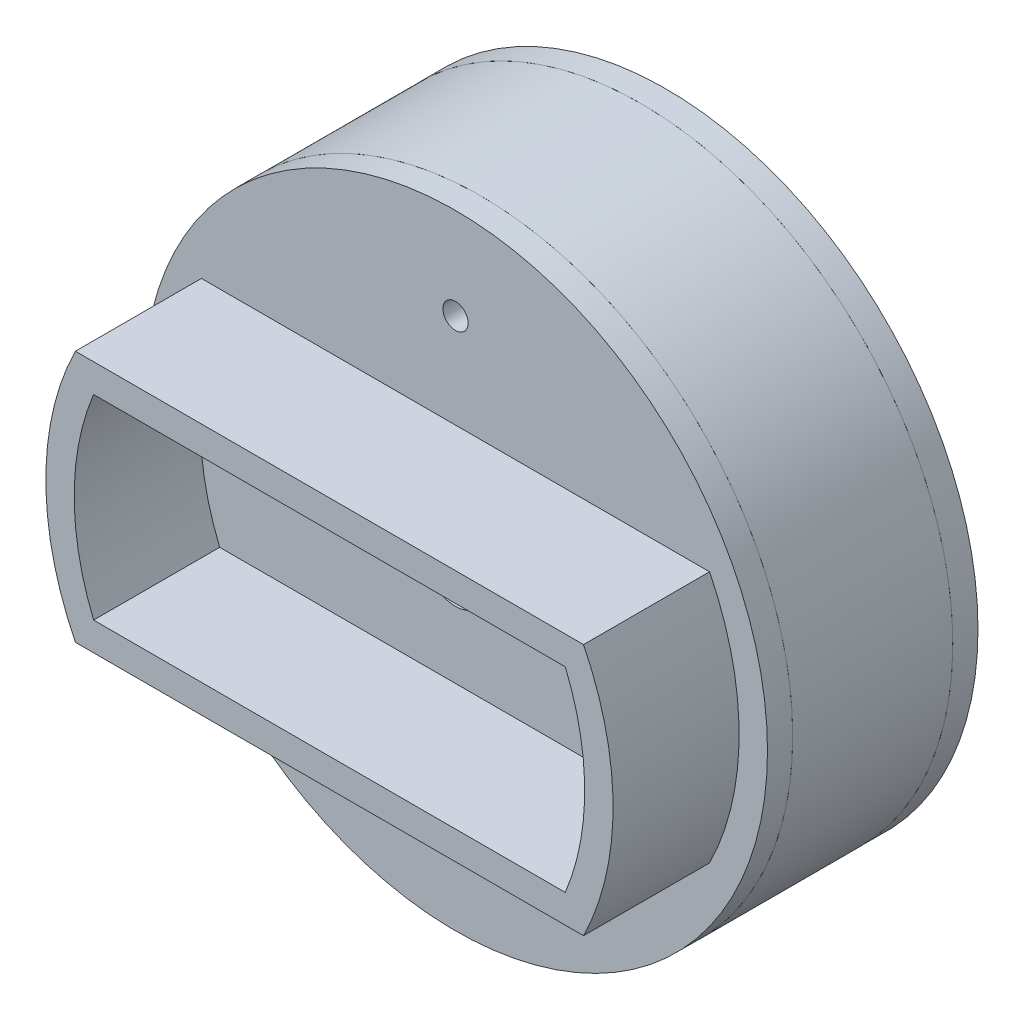
ISO-10303-21;
HEADER;
FILE_DESCRIPTION(('STEP AP214'),'2;1');
FILE_NAME('part.step','',(''),(''),'','','');
FILE_SCHEMA(('AUTOMOTIVE_DESIGN { 1 0 10303 214 1 1 1 1 }'));
ENDSEC;
DATA;
#1=APPLICATION_CONTEXT('core data for automotive mechanical design processes');
#2=APPLICATION_PROTOCOL_DEFINITION('international standard','automotive_design',2000,#1);
#3=PRODUCT_CONTEXT('',#1,'mechanical');
#4=PRODUCT('Part','Part','',(#3));
#5=PRODUCT_RELATED_PRODUCT_CATEGORY('part','',(#4));
#6=PRODUCT_DEFINITION_FORMATION('','',#4);
#7=PRODUCT_DEFINITION_CONTEXT('part definition',#1,'design');
#8=PRODUCT_DEFINITION('design','',#6,#7);
#9=PRODUCT_DEFINITION_SHAPE('','',#8);
#10=(LENGTH_UNIT() NAMED_UNIT(*) SI_UNIT(.MILLI.,.METRE.));
#11=(NAMED_UNIT(*) PLANE_ANGLE_UNIT() SI_UNIT($,.RADIAN.));
#12=(NAMED_UNIT(*) SI_UNIT($,.STERADIAN.) SOLID_ANGLE_UNIT());
#13=UNCERTAINTY_MEASURE_WITH_UNIT(LENGTH_MEASURE(1.E-05),#10,'distance_accuracy_value','');
#14=(GEOMETRIC_REPRESENTATION_CONTEXT(3) GLOBAL_UNCERTAINTY_ASSIGNED_CONTEXT((#13)) GLOBAL_UNIT_ASSIGNED_CONTEXT((#10,
#11,#12)) REPRESENTATION_CONTEXT('',''));
#15=CARTESIAN_POINT('',(0.,0.,0.));
#16=DIRECTION('',(0.,0.,1.));
#17=DIRECTION('',(1.,0.,0.));
#18=AXIS2_PLACEMENT_3D('',#15,#16,#17);
#19=CARTESIAN_POINT('',(0.,0.,-21.4));
#20=DIRECTION('',(0.,0.,-1.));
#21=DIRECTION('',(-1.,0.,0.));
#22=AXIS2_PLACEMENT_3D('',#19,#20,#21);
#23=PLANE('',#22);
#24=CARTESIAN_POINT('',(0.,-35.,-21.4));
#25=DIRECTION('',(0.,0.,-1.));
#26=DIRECTION('',(-1.,0.,0.));
#27=AXIS2_PLACEMENT_3D('',#24,#25,#26);
#28=CIRCLE('',#27,2.);
#29=CARTESIAN_POINT('',(-2.,-35.,-21.4));
#30=VERTEX_POINT('',#29);
#31=EDGE_CURVE('E77',#30,#30,#28,.T.);
#32=ORIENTED_EDGE('',*,*,#31,.F.);
#33=EDGE_LOOP('',(#32));
#34=FACE_BOUND('',#33,.T.);
#35=CARTESIAN_POINT('',(0.,0.,-21.4));
#36=DIRECTION('',(0.,0.,-1.));
#37=DIRECTION('',(-1.,0.,0.));
#38=AXIS2_PLACEMENT_3D('',#35,#36,#37);
#39=CIRCLE('',#38,49.5);
#40=CARTESIAN_POINT('',(-49.5,0.,-21.4));
#41=VERTEX_POINT('',#40);
#42=EDGE_CURVE('E12',#41,#41,#39,.T.);
#43=ORIENTED_EDGE('',*,*,#42,.T.);
#44=EDGE_LOOP('',(#43));
#45=FACE_BOUND('',#44,.T.);
#46=CARTESIAN_POINT('',(0.,0.,-21.4));
#47=DIRECTION('',(0.,0.,-1.));
#48=DIRECTION('',(-1.,0.,0.));
#49=AXIS2_PLACEMENT_3D('',#46,#47,#48);
#50=CIRCLE('',#49,4.9);
#51=CARTESIAN_POINT('',(-4.9,0.,-21.4));
#52=VERTEX_POINT('',#51);
#53=EDGE_CURVE('E72',#52,#52,#50,.T.);
#54=ORIENTED_EDGE('',*,*,#53,.F.);
#55=EDGE_LOOP('',(#54));
#56=FACE_BOUND('',#55,.T.);
#57=CARTESIAN_POINT('',(0.,35.,-21.4));
#58=DIRECTION('',(0.,0.,-1.));
#59=DIRECTION('',(-1.,0.,0.));
#60=AXIS2_PLACEMENT_3D('',#57,#58,#59);
#61=CIRCLE('',#60,2.);
#62=CARTESIAN_POINT('',(-2.00000000000001,35.,-21.4));
#63=VERTEX_POINT('',#62);
#64=EDGE_CURVE('E83',#63,#63,#61,.T.);
#65=ORIENTED_EDGE('',*,*,#64,.F.);
#66=EDGE_LOOP('',(#65));
#67=FACE_BOUND('',#66,.T.);
#68=ADVANCED_FACE('F61',(#34,#45,#56,#67),#23,.T.);
#69=CARTESIAN_POINT('',(0.,0.,4.));
#70=DIRECTION('',(0.,0.,-1.));
#71=DIRECTION('',(-1.,0.,0.));
#72=AXIS2_PLACEMENT_3D('',#69,#70,#71);
#73=PLANE('',#72);
#74=CARTESIAN_POINT('',(0.,0.,4.));
#75=DIRECTION('',(0.,0.,-1.));
#76=DIRECTION('',(-1.,0.,0.));
#77=AXIS2_PLACEMENT_3D('',#74,#75,#76);
#78=CIRCLE('',#77,49.5);
#79=CARTESIAN_POINT('',(-49.5,0.,4.));
#80=VERTEX_POINT('',#79);
#81=EDGE_CURVE('E65',#80,#80,#78,.T.);
#82=ORIENTED_EDGE('',*,*,#81,.F.);
#83=EDGE_LOOP('',(#82));
#84=FACE_BOUND('',#83,.T.);
#85=CARTESIAN_POINT('',(0.,0.,4.));
#86=DIRECTION('',(0.,0.,-1.));
#87=DIRECTION('',(-1.,0.,0.));
#88=AXIS2_PLACEMENT_3D('',#85,#86,#87);
#89=CIRCLE('',#88,4.9);
#90=CARTESIAN_POINT('',(-4.9,0.,4.));
#91=VERTEX_POINT('',#90);
#92=EDGE_CURVE('E74',#91,#91,#89,.T.);
#93=ORIENTED_EDGE('',*,*,#92,.T.);
#94=EDGE_LOOP('',(#93));
#95=FACE_BOUND('',#94,.T.);
#96=CARTESIAN_POINT('',(0.,-35.,4.));
#97=DIRECTION('',(0.,0.,-1.));
#98=DIRECTION('',(-1.,0.,0.));
#99=AXIS2_PLACEMENT_3D('',#96,#97,#98);
#100=CIRCLE('',#99,2.);
#101=CARTESIAN_POINT('',(-2.,-35.,4.));
#102=VERTEX_POINT('',#101);
#103=EDGE_CURVE('E80',#102,#102,#100,.T.);
#104=ORIENTED_EDGE('',*,*,#103,.T.);
#105=EDGE_LOOP('',(#104));
#106=FACE_BOUND('',#105,.T.);
#107=CARTESIAN_POINT('',(0.,35.,4.));
#108=DIRECTION('',(0.,0.,-1.));
#109=DIRECTION('',(-1.,0.,0.));
#110=AXIS2_PLACEMENT_3D('',#107,#108,#109);
#111=CIRCLE('',#110,2.);
#112=CARTESIAN_POINT('',(-2.00000000000001,35.,4.));
#113=VERTEX_POINT('',#112);
#114=EDGE_CURVE('E86',#113,#113,#111,.T.);
#115=ORIENTED_EDGE('',*,*,#114,.T.);
#116=EDGE_LOOP('',(#115));
#117=FACE_BOUND('',#116,.T.);
#118=ADVANCED_FACE('F96',(#84,#95,#106,#117),#73,.F.);
#119=CARTESIAN_POINT('',(0.,0.,-21.4));
#120=DIRECTION('',(0.,0.,1.));
#121=DIRECTION('',(1.,0.,0.));
#122=AXIS2_PLACEMENT_3D('',#119,#120,#121);
#123=CYLINDRICAL_SURFACE('',#122,49.5);
#124=ORIENTED_EDGE('',*,*,#42,.F.);
#125=EDGE_LOOP('',(#124));
#126=FACE_BOUND('',#125,.T.);
#127=ORIENTED_EDGE('',*,*,#81,.T.);
#128=EDGE_LOOP('',(#127));
#129=FACE_BOUND('',#128,.T.);
#130=ADVANCED_FACE('F63',(#126,#129),#123,.T.);
#131=CARTESIAN_POINT('',(0.,0.,-21.4));
#132=DIRECTION('',(0.,0.,1.));
#133=DIRECTION('',(1.,0.,0.));
#134=AXIS2_PLACEMENT_3D('',#131,#132,#133);
#135=CYLINDRICAL_SURFACE('',#134,4.9);
#136=ORIENTED_EDGE('',*,*,#53,.T.);
#137=EDGE_LOOP('',(#136));
#138=FACE_BOUND('',#137,.T.);
#139=ORIENTED_EDGE('',*,*,#92,.F.);
#140=EDGE_LOOP('',(#139));
#141=FACE_BOUND('',#140,.T.);
#142=ADVANCED_FACE('F105',(#138,#141),#135,.F.);
#143=CARTESIAN_POINT('',(0.,-35.,-21.4));
#144=DIRECTION('',(0.,0.,1.));
#145=DIRECTION('',(1.,0.,0.));
#146=AXIS2_PLACEMENT_3D('',#143,#144,#145);
#147=CYLINDRICAL_SURFACE('',#146,2.);
#148=ORIENTED_EDGE('',*,*,#31,.T.);
#149=EDGE_LOOP('',(#148));
#150=FACE_BOUND('',#149,.T.);
#151=ORIENTED_EDGE('',*,*,#103,.F.);
#152=EDGE_LOOP('',(#151));
#153=FACE_BOUND('',#152,.T.);
#154=ADVANCED_FACE('F108',(#150,#153),#147,.F.);
#155=CARTESIAN_POINT('',(0.,35.,-21.4));
#156=DIRECTION('',(0.,0.,1.));
#157=DIRECTION('',(1.,0.,0.));
#158=AXIS2_PLACEMENT_3D('',#155,#156,#157);
#159=CYLINDRICAL_SURFACE('',#158,2.);
#160=ORIENTED_EDGE('',*,*,#64,.T.);
#161=EDGE_LOOP('',(#160));
#162=FACE_BOUND('',#161,.T.);
#163=ORIENTED_EDGE('',*,*,#114,.F.);
#164=EDGE_LOOP('',(#163));
#165=FACE_BOUND('',#164,.T.);
#166=ADVANCED_FACE('F92',(#162,#165),#159,.F.);
#167=CLOSED_SHELL('',(#68,#118,#130,#142,#154,#166));
#168=MANIFOLD_SOLID_BREP('B2',#167);
#169=CARTESIAN_POINT('',(0.,0.,-21.4));
#170=DIRECTION('',(0.,0.,1.));
#171=DIRECTION('',(1.,0.,0.));
#172=AXIS2_PLACEMENT_3D('',#169,#170,#171);
#173=PLANE('',#172);
#174=CARTESIAN_POINT('',(0.,0.,-21.4));
#175=DIRECTION('',(0.,0.,1.));
#176=DIRECTION('',(1.,0.,0.));
#177=AXIS2_PLACEMENT_3D('',#174,#175,#176);
#178=CIRCLE('',#177,4.9);
#179=CARTESIAN_POINT('',(4.9,0.,-21.4));
#180=VERTEX_POINT('',#179);
#181=EDGE_CURVE('E179',#180,#180,#178,.T.);
#182=ORIENTED_EDGE('',*,*,#181,.F.);
#183=EDGE_LOOP('',(#182));
#184=FACE_BOUND('',#183,.T.);
#185=CARTESIAN_POINT('',(0.,-35.,-21.4));
#186=DIRECTION('',(0.,0.,1.));
#187=DIRECTION('',(1.,0.,0.));
#188=AXIS2_PLACEMENT_3D('',#185,#186,#187);
#189=CIRCLE('',#188,2.);
#190=CARTESIAN_POINT('',(2.,-35.,-21.4));
#191=VERTEX_POINT('',#190);
#192=EDGE_CURVE('E198',#191,#191,#189,.T.);
#193=ORIENTED_EDGE('',*,*,#192,.F.);
#194=EDGE_LOOP('',(#193));
#195=FACE_BOUND('',#194,.T.);
#196=CARTESIAN_POINT('',(0.,35.,-21.4));
#197=DIRECTION('',(0.,0.,1.));
#198=DIRECTION('',(1.,0.,0.));
#199=AXIS2_PLACEMENT_3D('',#196,#197,#198);
#200=CIRCLE('',#199,2.);
#201=CARTESIAN_POINT('',(1.99999999999999,35.,-21.4));
#202=VERTEX_POINT('',#201);
#203=EDGE_CURVE('E196',#202,#202,#200,.F.);
#204=ORIENTED_EDGE('',*,*,#203,.T.);
#205=EDGE_LOOP('',(#204));
#206=FACE_BOUND('',#205,.T.);
#207=CARTESIAN_POINT('',(0.,0.,-21.4));
#208=DIRECTION('',(0.,0.,1.));
#209=DIRECTION('',(1.,0.,0.));
#210=AXIS2_PLACEMENT_3D('',#207,#208,#209);
#211=CIRCLE('',#210,49.5);
#212=CARTESIAN_POINT('',(49.5,0.,-21.4));
#213=VERTEX_POINT('',#212);
#214=EDGE_CURVE('E193',#213,#213,#211,.T.);
#215=ORIENTED_EDGE('',*,*,#214,.T.);
#216=EDGE_LOOP('',(#215));
#217=FACE_BOUND('',#216,.T.);
#218=ADVANCED_FACE('F176',(#184,#195,#206,#217),#173,.T.);
#219=CARTESIAN_POINT('',(0.,0.,-17.4));
#220=DIRECTION('',(0.,0.,-1.));
#221=DIRECTION('',(-1.,0.,0.));
#222=AXIS2_PLACEMENT_3D('',#219,#220,#221);
#223=CYLINDRICAL_SURFACE('',#222,49.5);
#224=CARTESIAN_POINT('',(0.,0.,-25.4));
#225=DIRECTION('',(0.,0.,1.));
#226=DIRECTION('',(1.,0.,0.));
#227=AXIS2_PLACEMENT_3D('',#224,#225,#226);
#228=CIRCLE('',#227,49.5);
#229=CARTESIAN_POINT('',(49.5,0.,-25.4));
#230=VERTEX_POINT('',#229);
#231=EDGE_CURVE('E200',#230,#230,#228,.T.);
#232=ORIENTED_EDGE('',*,*,#231,.T.);
#233=EDGE_LOOP('',(#232));
#234=FACE_BOUND('',#233,.T.);
#235=ORIENTED_EDGE('',*,*,#214,.F.);
#236=EDGE_LOOP('',(#235));
#237=FACE_BOUND('',#236,.T.);
#238=ADVANCED_FACE('F211',(#234,#237),#223,.T.);
#239=CARTESIAN_POINT('',(0.,0.,3.6));
#240=DIRECTION('',(0.,0.,-1.));
#241=DIRECTION('',(-1.,0.,0.));
#242=AXIS2_PLACEMENT_3D('',#239,#240,#241);
#243=CYLINDRICAL_SURFACE('',#242,4.9);
#244=CARTESIAN_POINT('',(0.,0.,-25.4));
#245=DIRECTION('',(0.,0.,1.));
#246=DIRECTION('',(1.,0.,0.));
#247=AXIS2_PLACEMENT_3D('',#244,#245,#246);
#248=CIRCLE('',#247,4.9);
#249=CARTESIAN_POINT('',(4.9,0.,-25.4));
#250=VERTEX_POINT('',#249);
#251=EDGE_CURVE('E188',#250,#250,#248,.T.);
#252=ORIENTED_EDGE('',*,*,#251,.F.);
#253=EDGE_LOOP('',(#252));
#254=FACE_BOUND('',#253,.T.);
#255=ORIENTED_EDGE('',*,*,#181,.T.);
#256=EDGE_LOOP('',(#255));
#257=FACE_BOUND('',#256,.T.);
#258=ADVANCED_FACE('F207',(#254,#257),#243,.F.);
#259=CARTESIAN_POINT('',(0.,-35.,5.6));
#260=DIRECTION('',(0.,0.,-1.));
#261=DIRECTION('',(-1.,0.,0.));
#262=AXIS2_PLACEMENT_3D('',#259,#260,#261);
#263=CYLINDRICAL_SURFACE('',#262,2.);
#264=CARTESIAN_POINT('',(0.,-35.,-25.4));
#265=DIRECTION('',(0.,0.,1.));
#266=DIRECTION('',(1.,0.,0.));
#267=AXIS2_PLACEMENT_3D('',#264,#265,#266);
#268=CIRCLE('',#267,2.);
#269=CARTESIAN_POINT('',(2.,-35.,-25.4));
#270=VERTEX_POINT('',#269);
#271=EDGE_CURVE('E60',#270,#270,#268,.T.);
#272=ORIENTED_EDGE('',*,*,#271,.F.);
#273=EDGE_LOOP('',(#272));
#274=FACE_BOUND('',#273,.T.);
#275=ORIENTED_EDGE('',*,*,#192,.T.);
#276=EDGE_LOOP('',(#275));
#277=FACE_BOUND('',#276,.T.);
#278=ADVANCED_FACE('F224',(#274,#277),#263,.F.);
#279=CARTESIAN_POINT('',(0.,35.,5.6));
#280=DIRECTION('',(0.,0.,-1.));
#281=DIRECTION('',(-1.,0.,0.));
#282=AXIS2_PLACEMENT_3D('',#279,#280,#281);
#283=CYLINDRICAL_SURFACE('',#282,2.);
#284=CARTESIAN_POINT('',(0.,35.,-25.4));
#285=DIRECTION('',(0.,0.,1.));
#286=DIRECTION('',(1.,0.,0.));
#287=AXIS2_PLACEMENT_3D('',#284,#285,#286);
#288=CIRCLE('',#287,2.);
#289=CARTESIAN_POINT('',(1.99999999999999,35.,-25.4));
#290=VERTEX_POINT('',#289);
#291=EDGE_CURVE('E183',#290,#290,#288,.F.);
#292=ORIENTED_EDGE('',*,*,#291,.T.);
#293=EDGE_LOOP('',(#292));
#294=FACE_BOUND('',#293,.T.);
#295=ORIENTED_EDGE('',*,*,#203,.F.);
#296=EDGE_LOOP('',(#295));
#297=FACE_BOUND('',#296,.T.);
#298=ADVANCED_FACE('F229',(#294,#297),#283,.F.);
#299=CARTESIAN_POINT('',(0.,0.,-25.4));
#300=DIRECTION('',(0.,0.,1.));
#301=DIRECTION('',(1.,0.,0.));
#302=AXIS2_PLACEMENT_3D('',#299,#300,#301);
#303=PLANE('',#302);
#304=ORIENTED_EDGE('',*,*,#231,.F.);
#305=EDGE_LOOP('',(#304));
#306=FACE_BOUND('',#305,.T.);
#307=ORIENTED_EDGE('',*,*,#251,.T.);
#308=EDGE_LOOP('',(#307));
#309=FACE_BOUND('',#308,.T.);
#310=ORIENTED_EDGE('',*,*,#271,.T.);
#311=EDGE_LOOP('',(#310));
#312=FACE_BOUND('',#311,.T.);
#313=ORIENTED_EDGE('',*,*,#291,.F.);
#314=EDGE_LOOP('',(#313));
#315=FACE_BOUND('',#314,.T.);
#316=ADVANCED_FACE('F227',(#306,#309,#312,#315),#303,.F.);
#317=CLOSED_SHELL('',(#218,#238,#258,#278,#298,#316));
#318=MANIFOLD_SOLID_BREP('B7',#317);
#319=CARTESIAN_POINT('',(0.,0.,4.));
#320=DIRECTION('',(0.,0.,1.));
#321=DIRECTION('',(1.,0.,0.));
#322=AXIS2_PLACEMENT_3D('',#319,#320,#321);
#323=PLANE('',#322);
#324=CARTESIAN_POINT('',(0.,0.,4.));
#325=DIRECTION('',(0.,0.,1.));
#326=DIRECTION('',(1.,0.,0.));
#327=AXIS2_PLACEMENT_3D('',#324,#325,#326);
#328=CIRCLE('',#327,49.5);
#329=CARTESIAN_POINT('',(49.5,0.,4.));
#330=VERTEX_POINT('',#329);
#331=EDGE_CURVE('E283',#330,#330,#328,.T.);
#332=ORIENTED_EDGE('',*,*,#331,.F.);
#333=EDGE_LOOP('',(#332));
#334=FACE_BOUND('',#333,.T.);
#335=CARTESIAN_POINT('',(0.,35.,4.));
#336=DIRECTION('',(0.,0.,1.));
#337=DIRECTION('',(1.,0.,0.));
#338=AXIS2_PLACEMENT_3D('',#335,#336,#337);
#339=CIRCLE('',#338,2.);
#340=CARTESIAN_POINT('',(1.99999999999999,35.,4.));
#341=VERTEX_POINT('',#340);
#342=EDGE_CURVE('E389',#341,#341,#339,.F.);
#343=ORIENTED_EDGE('',*,*,#342,.F.);
#344=EDGE_LOOP('',(#343));
#345=FACE_BOUND('',#344,.T.);
#346=CARTESIAN_POINT('',(0.,-35.,4.));
#347=DIRECTION('',(0.,0.,1.));
#348=DIRECTION('',(1.,0.,0.));
#349=AXIS2_PLACEMENT_3D('',#346,#347,#348);
#350=CIRCLE('',#349,2.);
#351=CARTESIAN_POINT('',(2.,-35.,4.));
#352=VERTEX_POINT('',#351);
#353=EDGE_CURVE('E174',#352,#352,#350,.T.);
#354=ORIENTED_EDGE('',*,*,#353,.T.);
#355=EDGE_LOOP('',(#354));
#356=FACE_BOUND('',#355,.T.);
#357=CARTESIAN_POINT('',(0.,0.,4.));
#358=DIRECTION('',(0.,0.,1.));
#359=DIRECTION('',(1.,0.,0.));
#360=AXIS2_PLACEMENT_3D('',#357,#358,#359);
#361=CIRCLE('',#360,4.9);
#362=CARTESIAN_POINT('',(4.9,0.,4.));
#363=VERTEX_POINT('',#362);
#364=EDGE_CURVE('E288',#363,#363,#361,.T.);
#365=ORIENTED_EDGE('',*,*,#364,.T.);
#366=EDGE_LOOP('',(#365));
#367=FACE_BOUND('',#366,.T.);
#368=ADVANCED_FACE('F280',(#334,#345,#356,#367),#323,.F.);
#369=CARTESIAN_POINT('',(0.,0.,28.));
#370=DIRECTION('',(0.,0.,1.));
#371=DIRECTION('',(1.,0.,0.));
#372=AXIS2_PLACEMENT_3D('',#369,#370,#371);
#373=PLANE('',#372);
#374=DIRECTION('',(1.,0.,0.));
#375=VECTOR('',#374,1.);
#376=CARTESIAN_POINT('',(0.,-20.,28.));
#377=LINE('',#376,#375);
#378=CARTESIAN_POINT('',(-40.3112887414928,-20.,28.));
#379=VERTEX_POINT('',#378);
#380=CARTESIAN_POINT('',(40.3112887414928,-20.,28.));
#381=VERTEX_POINT('',#380);
#382=EDGE_CURVE('E357',#379,#381,#377,.T.);
#383=ORIENTED_EDGE('',*,*,#382,.T.);
#384=CARTESIAN_POINT('',(0.,0.,28.));
#385=DIRECTION('',(0.,0.,1.));
#386=DIRECTION('',(1.,0.,0.));
#387=AXIS2_PLACEMENT_3D('',#384,#385,#386);
#388=CIRCLE('',#387,45.);
#389=CARTESIAN_POINT('',(40.3112887414928,20.,28.));
#390=VERTEX_POINT('',#389);
#391=EDGE_CURVE('E345',#381,#390,#388,.T.);
#392=ORIENTED_EDGE('',*,*,#391,.T.);
#393=DIRECTION('',(1.,0.,0.));
#394=VECTOR('',#393,1.);
#395=CARTESIAN_POINT('',(0.,20.,28.));
#396=LINE('',#395,#394);
#397=CARTESIAN_POINT('',(-40.3112887414928,20.,28.));
#398=VERTEX_POINT('',#397);
#399=EDGE_CURVE('E356',#398,#390,#396,.T.);
#400=ORIENTED_EDGE('',*,*,#399,.F.);
#401=CARTESIAN_POINT('',(0.,0.,28.));
#402=DIRECTION('',(0.,0.,1.));
#403=DIRECTION('',(1.,0.,0.));
#404=AXIS2_PLACEMENT_3D('',#401,#402,#403);
#405=CIRCLE('',#404,45.);
#406=EDGE_CURVE('E363',#398,#379,#405,.T.);
#407=ORIENTED_EDGE('',*,*,#406,.T.);
#408=EDGE_LOOP('',(#383,#392,#400,#407));
#409=FACE_BOUND('',#408,.T.);
#410=CARTESIAN_POINT('',(0.,0.,28.));
#411=DIRECTION('',(0.,0.,1.));
#412=DIRECTION('',(1.,0.,0.));
#413=AXIS2_PLACEMENT_3D('',#410,#411,#412);
#414=CIRCLE('',#413,40.5);
#415=CARTESIAN_POINT('',(-37.4165738677394,15.5,28.));
#416=VERTEX_POINT('',#415);
#417=CARTESIAN_POINT('',(-37.4165738677394,-15.5,28.));
#418=VERTEX_POINT('',#417);
#419=EDGE_CURVE('E422',#416,#418,#414,.T.);
#420=ORIENTED_EDGE('',*,*,#419,.F.);
#421=DIRECTION('',(1.,0.,0.));
#422=VECTOR('',#421,1.);
#423=CARTESIAN_POINT('',(0.,15.5,28.));
#424=LINE('',#423,#422);
#425=CARTESIAN_POINT('',(37.4165738677394,15.5,28.));
#426=VERTEX_POINT('',#425);
#427=EDGE_CURVE('E425',#416,#426,#424,.T.);
#428=ORIENTED_EDGE('',*,*,#427,.T.);
#429=CARTESIAN_POINT('',(0.,0.,28.));
#430=DIRECTION('',(0.,0.,1.));
#431=DIRECTION('',(1.,0.,0.));
#432=AXIS2_PLACEMENT_3D('',#429,#430,#431);
#433=CIRCLE('',#432,40.5);
#434=CARTESIAN_POINT('',(37.4165738677394,-15.5,28.));
#435=VERTEX_POINT('',#434);
#436=EDGE_CURVE('E427',#435,#426,#433,.T.);
#437=ORIENTED_EDGE('',*,*,#436,.F.);
#438=DIRECTION('',(1.,0.,0.));
#439=VECTOR('',#438,1.);
#440=CARTESIAN_POINT('',(0.,-15.5,28.));
#441=LINE('',#440,#439);
#442=EDGE_CURVE('E430',#418,#435,#441,.T.);
#443=ORIENTED_EDGE('',*,*,#442,.F.);
#444=EDGE_LOOP('',(#420,#428,#437,#443));
#445=FACE_BOUND('',#444,.T.);
#446=ADVANCED_FACE('F360',(#409,#445),#373,.T.);
#447=CARTESIAN_POINT('',(0.,20.,28.));
#448=DIRECTION('',(0.,1.,0.));
#449=DIRECTION('',(0.,0.,1.));
#450=AXIS2_PLACEMENT_3D('',#447,#448,#449);
#451=PLANE('',#450);
#452=DIRECTION('',(1.,0.,0.));
#453=VECTOR('',#452,1.);
#454=CARTESIAN_POINT('',(0.,20.,8.));
#455=LINE('',#454,#453);
#456=CARTESIAN_POINT('',(-40.3112887414928,20.,8.));
#457=VERTEX_POINT('',#456);
#458=CARTESIAN_POINT('',(40.3112887414928,20.,8.));
#459=VERTEX_POINT('',#458);
#460=EDGE_CURVE('E296',#457,#459,#455,.T.);
#461=ORIENTED_EDGE('',*,*,#460,.F.);
#462=DIRECTION('',(0.,0.,-1.));
#463=VECTOR('',#462,1.);
#464=CARTESIAN_POINT('',(-40.3112887414928,20.,28.));
#465=LINE('',#464,#463);
#466=EDGE_CURVE('E378',#398,#457,#465,.T.);
#467=ORIENTED_EDGE('',*,*,#466,.F.);
#468=ORIENTED_EDGE('',*,*,#399,.T.);
#469=DIRECTION('',(0.,0.,-1.));
#470=VECTOR('',#469,1.);
#471=CARTESIAN_POINT('',(40.3112887414928,20.,28.));
#472=LINE('',#471,#470);
#473=EDGE_CURVE('E352',#390,#459,#472,.T.);
#474=ORIENTED_EDGE('',*,*,#473,.T.);
#475=EDGE_LOOP('',(#461,#467,#468,#474));
#476=FACE_BOUND('',#475,.T.);
#477=ADVANCED_FACE('F472',(#476),#451,.T.);
#478=CARTESIAN_POINT('',(0.,0.,28.));
#479=DIRECTION('',(0.,0.,-1.));
#480=DIRECTION('',(-1.,0.,0.));
#481=AXIS2_PLACEMENT_3D('',#478,#479,#480);
#482=CYLINDRICAL_SURFACE('',#481,45.);
#483=CARTESIAN_POINT('',(0.,0.,8.));
#484=DIRECTION('',(0.,0.,1.));
#485=DIRECTION('',(1.,0.,0.));
#486=AXIS2_PLACEMENT_3D('',#483,#484,#485);
#487=CIRCLE('',#486,45.);
#488=CARTESIAN_POINT('',(-40.3112887414928,-20.,8.));
#489=VERTEX_POINT('',#488);
#490=EDGE_CURVE('E438',#457,#489,#487,.T.);
#491=ORIENTED_EDGE('',*,*,#490,.T.);
#492=DIRECTION('',(0.,0.,-1.));
#493=VECTOR('',#492,1.);
#494=CARTESIAN_POINT('',(-40.3112887414928,-20.,28.));
#495=LINE('',#494,#493);
#496=EDGE_CURVE('E433',#379,#489,#495,.T.);
#497=ORIENTED_EDGE('',*,*,#496,.F.);
#498=ORIENTED_EDGE('',*,*,#406,.F.);
#499=ORIENTED_EDGE('',*,*,#466,.T.);
#500=EDGE_LOOP('',(#491,#497,#498,#499));
#501=FACE_BOUND('',#500,.T.);
#502=ADVANCED_FACE('F454',(#501),#482,.T.);
#503=CARTESIAN_POINT('',(0.,-20.,28.));
#504=DIRECTION('',(0.,1.,0.));
#505=DIRECTION('',(0.,0.,1.));
#506=AXIS2_PLACEMENT_3D('',#503,#504,#505);
#507=PLANE('',#506);
#508=DIRECTION('',(1.,0.,0.));
#509=VECTOR('',#508,1.);
#510=CARTESIAN_POINT('',(0.,-20.,8.));
#511=LINE('',#510,#509);
#512=CARTESIAN_POINT('',(40.3112887414928,-20.,8.));
#513=VERTEX_POINT('',#512);
#514=EDGE_CURVE('E371',#489,#513,#511,.T.);
#515=ORIENTED_EDGE('',*,*,#514,.T.);
#516=DIRECTION('',(0.,0.,-1.));
#517=VECTOR('',#516,1.);
#518=CARTESIAN_POINT('',(40.3112887414928,-20.,28.));
#519=LINE('',#518,#517);
#520=EDGE_CURVE('E350',#381,#513,#519,.T.);
#521=ORIENTED_EDGE('',*,*,#520,.F.);
#522=ORIENTED_EDGE('',*,*,#382,.F.);
#523=ORIENTED_EDGE('',*,*,#496,.T.);
#524=EDGE_LOOP('',(#515,#521,#522,#523));
#525=FACE_BOUND('',#524,.T.);
#526=ADVANCED_FACE('F369',(#525),#507,.F.);
#527=CARTESIAN_POINT('',(0.,0.,28.));
#528=DIRECTION('',(0.,0.,-1.));
#529=DIRECTION('',(-1.,0.,0.));
#530=AXIS2_PLACEMENT_3D('',#527,#528,#529);
#531=CYLINDRICAL_SURFACE('',#530,45.);
#532=CARTESIAN_POINT('',(0.,0.,8.));
#533=DIRECTION('',(0.,0.,1.));
#534=DIRECTION('',(1.,0.,0.));
#535=AXIS2_PLACEMENT_3D('',#532,#533,#534);
#536=CIRCLE('',#535,45.);
#537=EDGE_CURVE('E435',#513,#459,#536,.T.);
#538=ORIENTED_EDGE('',*,*,#537,.T.);
#539=ORIENTED_EDGE('',*,*,#473,.F.);
#540=ORIENTED_EDGE('',*,*,#391,.F.);
#541=ORIENTED_EDGE('',*,*,#520,.T.);
#542=EDGE_LOOP('',(#538,#539,#540,#541));
#543=FACE_BOUND('',#542,.T.);
#544=ADVANCED_FACE('F348',(#543),#531,.T.);
#545=CARTESIAN_POINT('',(0.,0.,8.));
#546=DIRECTION('',(0.,0.,1.));
#547=DIRECTION('',(1.,0.,0.));
#548=AXIS2_PLACEMENT_3D('',#545,#546,#547);
#549=PLANE('',#548);
#550=CARTESIAN_POINT('',(0.,-35.,8.));
#551=DIRECTION('',(0.,0.,1.));
#552=DIRECTION('',(1.,0.,0.));
#553=AXIS2_PLACEMENT_3D('',#550,#551,#552);
#554=CIRCLE('',#553,2.);
#555=CARTESIAN_POINT('',(2.,-35.,8.));
#556=VERTEX_POINT('',#555);
#557=EDGE_CURVE('E413',#556,#556,#554,.F.);
#558=ORIENTED_EDGE('',*,*,#557,.T.);
#559=EDGE_LOOP('',(#558));
#560=FACE_BOUND('',#559,.T.);
#561=CARTESIAN_POINT('',(0.,0.,8.));
#562=DIRECTION('',(0.,0.,1.));
#563=DIRECTION('',(1.,0.,0.));
#564=AXIS2_PLACEMENT_3D('',#561,#562,#563);
#565=CIRCLE('',#564,49.5);
#566=CARTESIAN_POINT('',(49.5,0.,8.));
#567=VERTEX_POINT('',#566);
#568=EDGE_CURVE('E385',#567,#567,#565,.T.);
#569=ORIENTED_EDGE('',*,*,#568,.T.);
#570=EDGE_LOOP('',(#569));
#571=FACE_BOUND('',#570,.T.);
#572=ORIENTED_EDGE('',*,*,#537,.F.);
#573=ORIENTED_EDGE('',*,*,#514,.F.);
#574=ORIENTED_EDGE('',*,*,#490,.F.);
#575=ORIENTED_EDGE('',*,*,#460,.T.);
#576=EDGE_LOOP('',(#572,#573,#574,#575));
#577=FACE_BOUND('',#576,.T.);
#578=CARTESIAN_POINT('',(0.,35.,8.));
#579=DIRECTION('',(0.,0.,1.));
#580=DIRECTION('',(1.,0.,0.));
#581=AXIS2_PLACEMENT_3D('',#578,#579,#580);
#582=CIRCLE('',#581,2.);
#583=CARTESIAN_POINT('',(1.99999999999999,35.,8.));
#584=VERTEX_POINT('',#583);
#585=EDGE_CURVE('E415',#584,#584,#582,.T.);
#586=ORIENTED_EDGE('',*,*,#585,.F.);
#587=EDGE_LOOP('',(#586));
#588=FACE_BOUND('',#587,.T.);
#589=ADVANCED_FACE('F456',(#560,#571,#577,#588),#549,.T.);
#590=CARTESIAN_POINT('',(0.,35.,31.));
#591=DIRECTION('',(0.,0.,-1.));
#592=DIRECTION('',(-1.,0.,0.));
#593=AXIS2_PLACEMENT_3D('',#590,#591,#592);
#594=CYLINDRICAL_SURFACE('',#593,2.);
#595=ORIENTED_EDGE('',*,*,#342,.T.);
#596=EDGE_LOOP('',(#595));
#597=FACE_BOUND('',#596,.T.);
#598=ORIENTED_EDGE('',*,*,#585,.T.);
#599=EDGE_LOOP('',(#598));
#600=FACE_BOUND('',#599,.T.);
#601=ADVANCED_FACE('F409',(#597,#600),#594,.F.);
#602=CARTESIAN_POINT('',(0.,-35.,31.));
#603=DIRECTION('',(0.,0.,-1.));
#604=DIRECTION('',(-1.,0.,0.));
#605=AXIS2_PLACEMENT_3D('',#602,#603,#604);
#606=CYLINDRICAL_SURFACE('',#605,2.);
#607=ORIENTED_EDGE('',*,*,#353,.F.);
#608=EDGE_LOOP('',(#607));
#609=FACE_BOUND('',#608,.T.);
#610=ORIENTED_EDGE('',*,*,#557,.F.);
#611=EDGE_LOOP('',(#610));
#612=FACE_BOUND('',#611,.T.);
#613=ADVANCED_FACE('F406',(#609,#612),#606,.F.);
#614=CARTESIAN_POINT('',(0.,0.,8.));
#615=DIRECTION('',(0.,0.,-1.));
#616=DIRECTION('',(-1.,0.,0.));
#617=AXIS2_PLACEMENT_3D('',#614,#615,#616);
#618=CYLINDRICAL_SURFACE('',#617,49.5);
#619=ORIENTED_EDGE('',*,*,#331,.T.);
#620=EDGE_LOOP('',(#619));
#621=FACE_BOUND('',#620,.T.);
#622=ORIENTED_EDGE('',*,*,#568,.F.);
#623=EDGE_LOOP('',(#622));
#624=FACE_BOUND('',#623,.T.);
#625=ADVANCED_FACE('F397',(#621,#624),#618,.T.);
#626=CARTESIAN_POINT('',(0.,15.5,28.));
#627=DIRECTION('',(0.,1.,0.));
#628=DIRECTION('',(0.,0.,1.));
#629=AXIS2_PLACEMENT_3D('',#626,#627,#628);
#630=PLANE('',#629);
#631=DIRECTION('',(1.,0.,0.));
#632=VECTOR('',#631,1.);
#633=CARTESIAN_POINT('',(0.,15.5,8.));
#634=LINE('',#633,#632);
#635=CARTESIAN_POINT('',(-37.4165738677394,15.5,8.));
#636=VERTEX_POINT('',#635);
#637=CARTESIAN_POINT('',(37.4165738677394,15.5,8.));
#638=VERTEX_POINT('',#637);
#639=EDGE_CURVE('E304',#636,#638,#634,.T.);
#640=ORIENTED_EDGE('',*,*,#639,.T.);
#641=DIRECTION('',(0.,0.,-1.));
#642=VECTOR('',#641,1.);
#643=CARTESIAN_POINT('',(37.4165738677394,15.5,28.));
#644=LINE('',#643,#642);
#645=EDGE_CURVE('E448',#426,#638,#644,.T.);
#646=ORIENTED_EDGE('',*,*,#645,.F.);
#647=ORIENTED_EDGE('',*,*,#427,.F.);
#648=DIRECTION('',(0.,0.,-1.));
#649=VECTOR('',#648,1.);
#650=CARTESIAN_POINT('',(-37.4165738677394,15.5,28.));
#651=LINE('',#650,#649);
#652=EDGE_CURVE('E386',#416,#636,#651,.T.);
#653=ORIENTED_EDGE('',*,*,#652,.T.);
#654=EDGE_LOOP('',(#640,#646,#647,#653));
#655=FACE_BOUND('',#654,.T.);
#656=ADVANCED_FACE('F481',(#655),#630,.F.);
#657=CARTESIAN_POINT('',(0.,0.,28.));
#658=DIRECTION('',(0.,0.,-1.));
#659=DIRECTION('',(-1.,0.,0.));
#660=AXIS2_PLACEMENT_3D('',#657,#658,#659);
#661=CYLINDRICAL_SURFACE('',#660,40.5);
#662=CARTESIAN_POINT('',(0.,0.,8.));
#663=DIRECTION('',(0.,0.,1.));
#664=DIRECTION('',(1.,0.,0.));
#665=AXIS2_PLACEMENT_3D('',#662,#663,#664);
#666=CIRCLE('',#665,40.5);
#667=CARTESIAN_POINT('',(37.4165738677394,-15.5,8.));
#668=VERTEX_POINT('',#667);
#669=EDGE_CURVE('E443',#668,#638,#666,.T.);
#670=ORIENTED_EDGE('',*,*,#669,.F.);
#671=DIRECTION('',(0.,0.,-1.));
#672=VECTOR('',#671,1.);
#673=CARTESIAN_POINT('',(37.4165738677394,-15.5,28.));
#674=LINE('',#673,#672);
#675=EDGE_CURVE('E376',#435,#668,#674,.T.);
#676=ORIENTED_EDGE('',*,*,#675,.F.);
#677=ORIENTED_EDGE('',*,*,#436,.T.);
#678=ORIENTED_EDGE('',*,*,#645,.T.);
#679=EDGE_LOOP('',(#670,#676,#677,#678));
#680=FACE_BOUND('',#679,.T.);
#681=ADVANCED_FACE('F477',(#680),#661,.F.);
#682=CARTESIAN_POINT('',(0.,-15.5,28.));
#683=DIRECTION('',(0.,1.,0.));
#684=DIRECTION('',(0.,0.,1.));
#685=AXIS2_PLACEMENT_3D('',#682,#683,#684);
#686=PLANE('',#685);
#687=DIRECTION('',(1.,0.,0.));
#688=VECTOR('',#687,1.);
#689=CARTESIAN_POINT('',(0.,-15.5,8.));
#690=LINE('',#689,#688);
#691=CARTESIAN_POINT('',(-37.4165738677394,-15.5,8.));
#692=VERTEX_POINT('',#691);
#693=EDGE_CURVE('E367',#692,#668,#690,.T.);
#694=ORIENTED_EDGE('',*,*,#693,.F.);
#695=DIRECTION('',(0.,0.,-1.));
#696=VECTOR('',#695,1.);
#697=CARTESIAN_POINT('',(-37.4165738677394,-15.5,28.));
#698=LINE('',#697,#696);
#699=EDGE_CURVE('E373',#418,#692,#698,.T.);
#700=ORIENTED_EDGE('',*,*,#699,.F.);
#701=ORIENTED_EDGE('',*,*,#442,.T.);
#702=ORIENTED_EDGE('',*,*,#675,.T.);
#703=EDGE_LOOP('',(#694,#700,#701,#702));
#704=FACE_BOUND('',#703,.T.);
#705=ADVANCED_FACE('F473',(#704),#686,.T.);
#706=CARTESIAN_POINT('',(0.,0.,28.));
#707=DIRECTION('',(0.,0.,-1.));
#708=DIRECTION('',(-1.,0.,0.));
#709=AXIS2_PLACEMENT_3D('',#706,#707,#708);
#710=CYLINDRICAL_SURFACE('',#709,40.5);
#711=CARTESIAN_POINT('',(0.,0.,8.));
#712=DIRECTION('',(0.,0.,1.));
#713=DIRECTION('',(1.,0.,0.));
#714=AXIS2_PLACEMENT_3D('',#711,#712,#713);
#715=CIRCLE('',#714,40.5);
#716=EDGE_CURVE('E440',#636,#692,#715,.T.);
#717=ORIENTED_EDGE('',*,*,#716,.F.);
#718=ORIENTED_EDGE('',*,*,#652,.F.);
#719=ORIENTED_EDGE('',*,*,#419,.T.);
#720=ORIENTED_EDGE('',*,*,#699,.T.);
#721=EDGE_LOOP('',(#717,#718,#719,#720));
#722=FACE_BOUND('',#721,.T.);
#723=ADVANCED_FACE('F476',(#722),#710,.F.);
#724=ORIENTED_EDGE('',*,*,#716,.T.);
#725=ORIENTED_EDGE('',*,*,#693,.T.);
#726=ORIENTED_EDGE('',*,*,#669,.T.);
#727=ORIENTED_EDGE('',*,*,#639,.F.);
#728=EDGE_LOOP('',(#724,#725,#726,#727));
#729=FACE_BOUND('',#728,.T.);
#730=CARTESIAN_POINT('',(0.,0.,8.));
#731=DIRECTION('',(0.,0.,1.));
#732=DIRECTION('',(1.,0.,0.));
#733=AXIS2_PLACEMENT_3D('',#730,#731,#732);
#734=CIRCLE('',#733,4.9);
#735=CARTESIAN_POINT('',(4.9,0.,8.));
#736=VERTEX_POINT('',#735);
#737=EDGE_CURVE('E382',#736,#736,#734,.F.);
#738=ORIENTED_EDGE('',*,*,#737,.T.);
#739=EDGE_LOOP('',(#738));
#740=FACE_BOUND('',#739,.T.);
#741=ADVANCED_FACE('F460',(#729,#740),#549,.T.);
#742=CARTESIAN_POINT('',(0.,0.,29.));
#743=DIRECTION('',(0.,0.,-1.));
#744=DIRECTION('',(-1.,0.,0.));
#745=AXIS2_PLACEMENT_3D('',#742,#743,#744);
#746=CYLINDRICAL_SURFACE('',#745,4.9);
#747=ORIENTED_EDGE('',*,*,#364,.F.);
#748=EDGE_LOOP('',(#747));
#749=FACE_BOUND('',#748,.T.);
#750=ORIENTED_EDGE('',*,*,#737,.F.);
#751=EDGE_LOOP('',(#750));
#752=FACE_BOUND('',#751,.T.);
#753=ADVANCED_FACE('F497',(#749,#752),#746,.F.);
#754=CLOSED_SHELL('',(#368,#446,#477,#502,#526,#544,#589,#601,#613,#625,#656,#681,#705,#723,
#741,#753));
#755=MANIFOLD_SOLID_BREP('B55',#754);
#756=ADVANCED_BREP_SHAPE_REPRESENTATION('',(#18,#168,#318,#755),#14);
#757=SHAPE_DEFINITION_REPRESENTATION(#9,#756);
ENDSEC;
END-ISO-10303-21;
